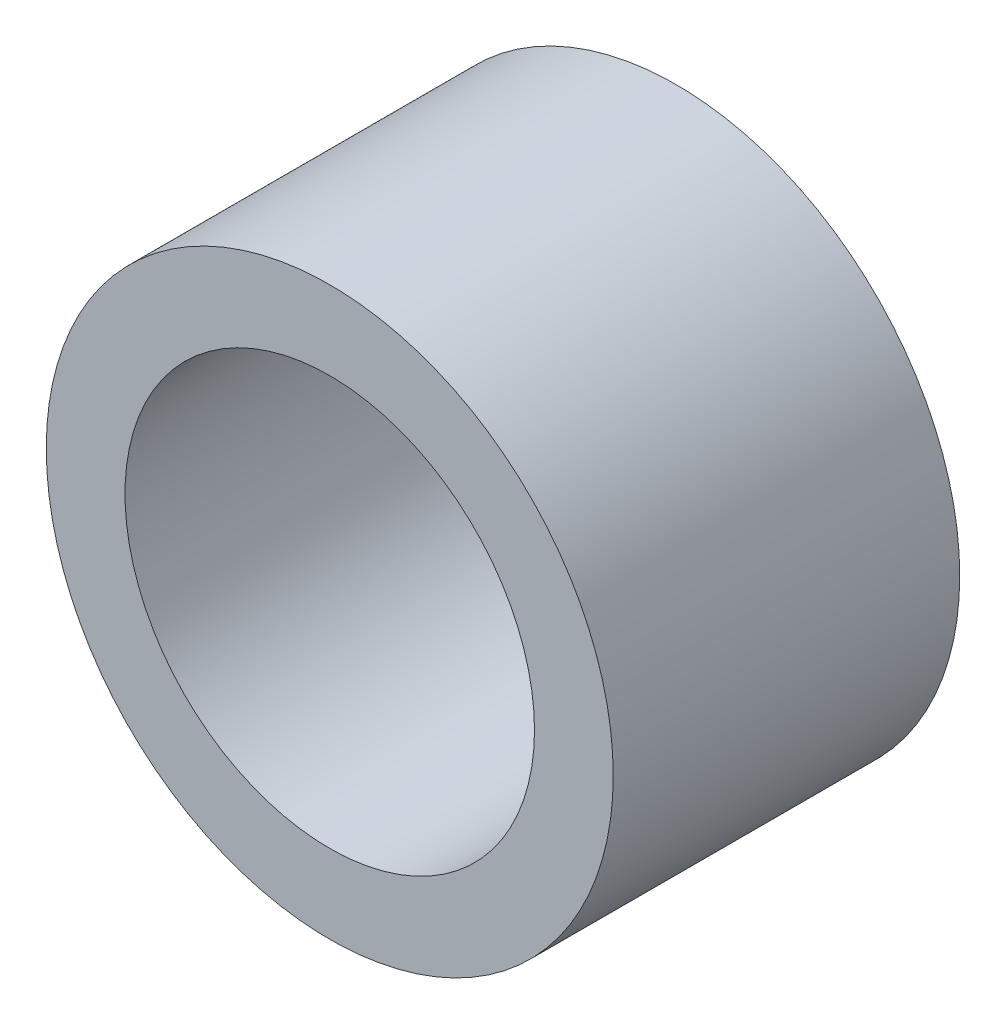
ISO-10303-21;
HEADER;
FILE_DESCRIPTION(('STEP AP214'),'2;1');
FILE_NAME('part.step','',(''),(''),'','','');
FILE_SCHEMA(('AUTOMOTIVE_DESIGN { 1 0 10303 214 1 1 1 1 }'));
ENDSEC;
DATA;
#1=APPLICATION_CONTEXT('core data for automotive mechanical design processes');
#2=APPLICATION_PROTOCOL_DEFINITION('international standard','automotive_design',2000,#1);
#3=PRODUCT_CONTEXT('',#1,'mechanical');
#4=PRODUCT('Part','Part','',(#3));
#5=PRODUCT_RELATED_PRODUCT_CATEGORY('part','',(#4));
#6=PRODUCT_DEFINITION_FORMATION('','',#4);
#7=PRODUCT_DEFINITION_CONTEXT('part definition',#1,'design');
#8=PRODUCT_DEFINITION('design','',#6,#7);
#9=PRODUCT_DEFINITION_SHAPE('','',#8);
#10=(LENGTH_UNIT() NAMED_UNIT(*) SI_UNIT(.MILLI.,.METRE.));
#11=(NAMED_UNIT(*) PLANE_ANGLE_UNIT() SI_UNIT($,.RADIAN.));
#12=(NAMED_UNIT(*) SI_UNIT($,.STERADIAN.) SOLID_ANGLE_UNIT());
#13=UNCERTAINTY_MEASURE_WITH_UNIT(LENGTH_MEASURE(1.E-05),#10,'distance_accuracy_value','');
#14=(GEOMETRIC_REPRESENTATION_CONTEXT(3) GLOBAL_UNCERTAINTY_ASSIGNED_CONTEXT((#13)) GLOBAL_UNIT_ASSIGNED_CONTEXT((#10,
#11,#12)) REPRESENTATION_CONTEXT('',''));
#15=CARTESIAN_POINT('',(0.,0.,0.));
#16=DIRECTION('',(0.,0.,1.));
#17=DIRECTION('',(1.,0.,0.));
#18=AXIS2_PLACEMENT_3D('',#15,#16,#17);
#19=CARTESIAN_POINT('',(0.,0.,5.5));
#20=DIRECTION('',(0.,0.,1.));
#21=DIRECTION('',(1.,0.,0.));
#22=AXIS2_PLACEMENT_3D('',#19,#20,#21);
#23=PLANE('',#22);
#24=CARTESIAN_POINT('',(0.,0.,5.5));
#25=DIRECTION('',(0.,0.,1.));
#26=DIRECTION('',(1.,0.,0.));
#27=AXIS2_PLACEMENT_3D('',#24,#25,#26);
#28=CIRCLE('',#27,4.5);
#29=CARTESIAN_POINT('',(4.5,0.,5.5));
#30=VERTEX_POINT('',#29);
#31=EDGE_CURVE('E10',#30,#30,#28,.T.);
#32=ORIENTED_EDGE('',*,*,#31,.T.);
#33=EDGE_LOOP('',(#32));
#34=FACE_BOUND('',#33,.T.);
#35=CARTESIAN_POINT('',(0.,0.,5.5));
#36=DIRECTION('',(0.,0.,1.));
#37=DIRECTION('',(1.,0.,0.));
#38=AXIS2_PLACEMENT_3D('',#35,#36,#37);
#39=CIRCLE('',#38,3.25);
#40=CARTESIAN_POINT('',(3.25,0.,5.5));
#41=VERTEX_POINT('',#40);
#42=EDGE_CURVE('E42',#41,#41,#39,.T.);
#43=ORIENTED_EDGE('',*,*,#42,.F.);
#44=EDGE_LOOP('',(#43));
#45=FACE_BOUND('',#44,.T.);
#46=ADVANCED_FACE('F31',(#34,#45),#23,.T.);
#47=CARTESIAN_POINT('',(0.,0.,0.));
#48=DIRECTION('',(0.,0.,1.));
#49=DIRECTION('',(1.,0.,0.));
#50=AXIS2_PLACEMENT_3D('',#47,#48,#49);
#51=PLANE('',#50);
#52=CARTESIAN_POINT('',(0.,0.,0.));
#53=DIRECTION('',(0.,0.,1.));
#54=DIRECTION('',(1.,0.,0.));
#55=AXIS2_PLACEMENT_3D('',#52,#53,#54);
#56=CIRCLE('',#55,4.5);
#57=CARTESIAN_POINT('',(4.5,0.,0.));
#58=VERTEX_POINT('',#57);
#59=EDGE_CURVE('E35',#58,#58,#56,.T.);
#60=ORIENTED_EDGE('',*,*,#59,.F.);
#61=EDGE_LOOP('',(#60));
#62=FACE_BOUND('',#61,.T.);
#63=CARTESIAN_POINT('',(0.,0.,0.));
#64=DIRECTION('',(0.,0.,1.));
#65=DIRECTION('',(1.,0.,0.));
#66=AXIS2_PLACEMENT_3D('',#63,#64,#65);
#67=CIRCLE('',#66,3.25);
#68=CARTESIAN_POINT('',(3.25,0.,0.));
#69=VERTEX_POINT('',#68);
#70=EDGE_CURVE('E44',#69,#69,#67,.T.);
#71=ORIENTED_EDGE('',*,*,#70,.T.);
#72=EDGE_LOOP('',(#71));
#73=FACE_BOUND('',#72,.T.);
#74=ADVANCED_FACE('F54',(#62,#73),#51,.F.);
#75=CARTESIAN_POINT('',(0.,0.,5.5));
#76=DIRECTION('',(0.,0.,-1.));
#77=DIRECTION('',(-1.,0.,0.));
#78=AXIS2_PLACEMENT_3D('',#75,#76,#77);
#79=CYLINDRICAL_SURFACE('',#78,4.5);
#80=ORIENTED_EDGE('',*,*,#31,.F.);
#81=EDGE_LOOP('',(#80));
#82=FACE_BOUND('',#81,.T.);
#83=ORIENTED_EDGE('',*,*,#59,.T.);
#84=EDGE_LOOP('',(#83));
#85=FACE_BOUND('',#84,.T.);
#86=ADVANCED_FACE('F33',(#82,#85),#79,.T.);
#87=CARTESIAN_POINT('',(0.,0.,5.5));
#88=DIRECTION('',(0.,0.,-1.));
#89=DIRECTION('',(-1.,0.,0.));
#90=AXIS2_PLACEMENT_3D('',#87,#88,#89);
#91=CYLINDRICAL_SURFACE('',#90,3.25);
#92=ORIENTED_EDGE('',*,*,#42,.T.);
#93=EDGE_LOOP('',(#92));
#94=FACE_BOUND('',#93,.T.);
#95=ORIENTED_EDGE('',*,*,#70,.F.);
#96=EDGE_LOOP('',(#95));
#97=FACE_BOUND('',#96,.T.);
#98=ADVANCED_FACE('F50',(#94,#97),#91,.F.);
#99=CLOSED_SHELL('',(#46,#74,#86,#98));
#100=MANIFOLD_SOLID_BREP('B2',#99);
#101=ADVANCED_BREP_SHAPE_REPRESENTATION('',(#18,#100),#14);
#102=SHAPE_DEFINITION_REPRESENTATION(#9,#101);
ENDSEC;
END-ISO-10303-21;
